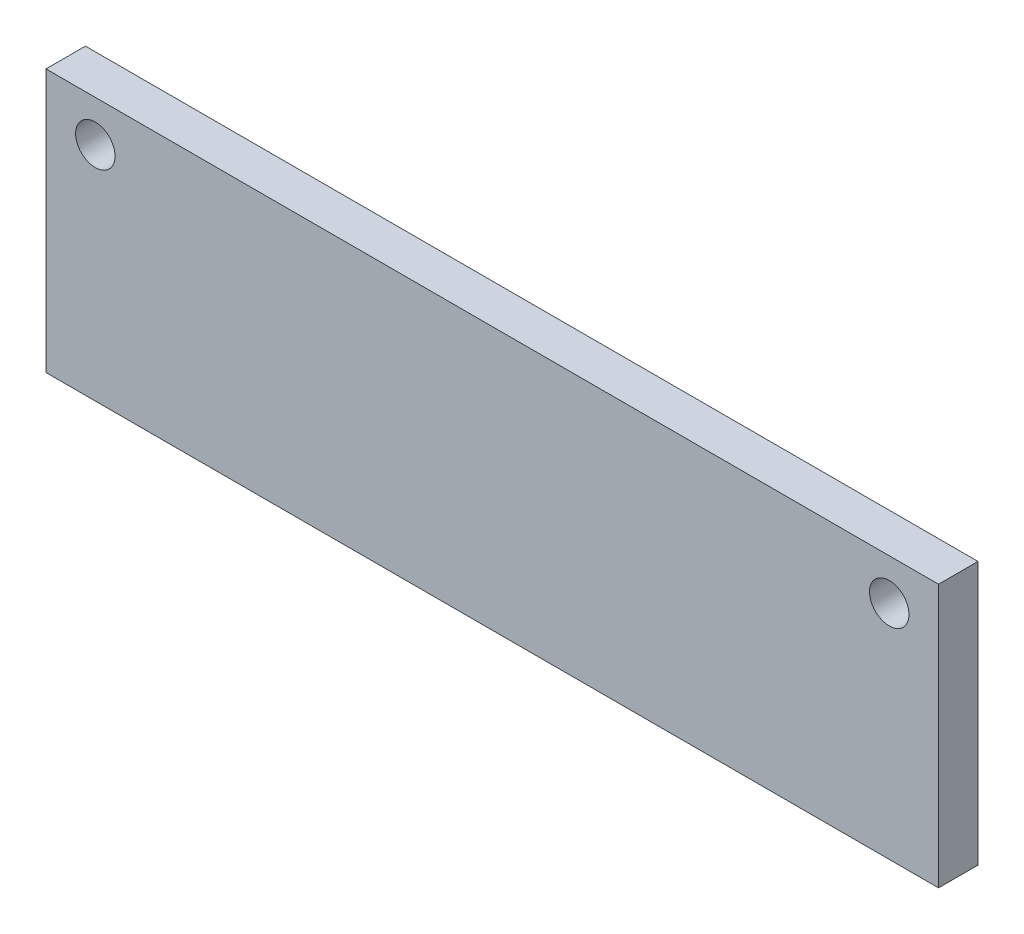
ISO-10303-21;
HEADER;
FILE_DESCRIPTION(('STEP AP214'),'2;1');
FILE_NAME('part.step','',(''),(''),'','','');
FILE_SCHEMA(('AUTOMOTIVE_DESIGN { 1 0 10303 214 1 1 1 1 }'));
ENDSEC;
DATA;
#1=APPLICATION_CONTEXT('core data for automotive mechanical design processes');
#2=APPLICATION_PROTOCOL_DEFINITION('international standard','automotive_design',2000,#1);
#3=PRODUCT_CONTEXT('',#1,'mechanical');
#4=PRODUCT('Part','Part','',(#3));
#5=PRODUCT_RELATED_PRODUCT_CATEGORY('part','',(#4));
#6=PRODUCT_DEFINITION_FORMATION('','',#4);
#7=PRODUCT_DEFINITION_CONTEXT('part definition',#1,'design');
#8=PRODUCT_DEFINITION('design','',#6,#7);
#9=PRODUCT_DEFINITION_SHAPE('','',#8);
#10=(LENGTH_UNIT() NAMED_UNIT(*) SI_UNIT(.MILLI.,.METRE.));
#11=(NAMED_UNIT(*) PLANE_ANGLE_UNIT() SI_UNIT($,.RADIAN.));
#12=(NAMED_UNIT(*) SI_UNIT($,.STERADIAN.) SOLID_ANGLE_UNIT());
#13=UNCERTAINTY_MEASURE_WITH_UNIT(LENGTH_MEASURE(1.E-05),#10,'distance_accuracy_value','');
#14=(GEOMETRIC_REPRESENTATION_CONTEXT(3) GLOBAL_UNCERTAINTY_ASSIGNED_CONTEXT((#13)) GLOBAL_UNIT_ASSIGNED_CONTEXT((#10,
#11,#12)) REPRESENTATION_CONTEXT('',''));
#15=CARTESIAN_POINT('',(0.,0.,0.));
#16=DIRECTION('',(0.,0.,1.));
#17=DIRECTION('',(1.,0.,0.));
#18=AXIS2_PLACEMENT_3D('',#15,#16,#17);
#19=CARTESIAN_POINT('',(-59.15,65.,40.));
#20=DIRECTION('',(0.,0.,1.));
#21=DIRECTION('',(1.,0.,0.));
#22=AXIS2_PLACEMENT_3D('',#19,#20,#21);
#23=PLANE('',#22);
#24=CARTESIAN_POINT('',(-7.85,78.5,40.));
#25=DIRECTION('',(0.,0.,1.));
#26=DIRECTION('',(1.,0.,0.));
#27=AXIS2_PLACEMENT_3D('',#24,#25,#26);
#28=CIRCLE('',#27,1.2);
#29=CARTESIAN_POINT('',(-6.65,78.5,40.));
#30=VERTEX_POINT('',#29);
#31=EDGE_CURVE('E83',#30,#30,#28,.T.);
#32=ORIENTED_EDGE('',*,*,#31,.T.);
#33=EDGE_LOOP('',(#32));
#34=FACE_BOUND('',#33,.T.);
#35=CARTESIAN_POINT('',(-56.15,78.5,40.));
#36=DIRECTION('',(0.,0.,1.));
#37=DIRECTION('',(1.,0.,0.));
#38=AXIS2_PLACEMENT_3D('',#35,#36,#37);
#39=CIRCLE('',#38,1.2);
#40=CARTESIAN_POINT('',(-54.95,78.5,40.));
#41=VERTEX_POINT('',#40);
#42=EDGE_CURVE('E19',#41,#41,#39,.T.);
#43=ORIENTED_EDGE('',*,*,#42,.T.);
#44=EDGE_LOOP('',(#43));
#45=FACE_BOUND('',#44,.T.);
#46=DIRECTION('',(0.,1.,0.));
#47=VECTOR('',#46,1.);
#48=CARTESIAN_POINT('',(-4.85,65.,40.));
#49=LINE('',#48,#47);
#50=CARTESIAN_POINT('',(-4.85,65.,40.));
#51=VERTEX_POINT('',#50);
#52=CARTESIAN_POINT('',(-4.85,81.,40.));
#53=VERTEX_POINT('',#52);
#54=EDGE_CURVE('E61',#51,#53,#49,.T.);
#55=ORIENTED_EDGE('',*,*,#54,.F.);
#56=DIRECTION('',(1.,0.,0.));
#57=VECTOR('',#56,1.);
#58=CARTESIAN_POINT('',(-59.15,65.,40.));
#59=LINE('',#58,#57);
#60=CARTESIAN_POINT('',(-59.15,65.,40.));
#61=VERTEX_POINT('',#60);
#62=EDGE_CURVE('E55',#51,#61,#59,.F.);
#63=ORIENTED_EDGE('',*,*,#62,.T.);
#64=DIRECTION('',(0.,1.,0.));
#65=VECTOR('',#64,1.);
#66=CARTESIAN_POINT('',(-59.15,65.,40.));
#67=LINE('',#66,#65);
#68=CARTESIAN_POINT('',(-59.15,81.,40.));
#69=VERTEX_POINT('',#68);
#70=EDGE_CURVE('E59',#61,#69,#67,.T.);
#71=ORIENTED_EDGE('',*,*,#70,.T.);
#72=DIRECTION('',(1.,0.,0.));
#73=VECTOR('',#72,1.);
#74=CARTESIAN_POINT('',(-59.15,81.,40.));
#75=LINE('',#74,#73);
#76=EDGE_CURVE('E94',#53,#69,#75,.F.);
#77=ORIENTED_EDGE('',*,*,#76,.F.);
#78=EDGE_LOOP('',(#55,#63,#71,#77));
#79=FACE_BOUND('',#78,.T.);
#80=ADVANCED_FACE('F16',(#34,#45,#79),#23,.F.);
#81=CARTESIAN_POINT('',(-59.15,65.,40.));
#82=DIRECTION('',(1.,0.,0.));
#83=DIRECTION('',(0.,0.,-1.));
#84=AXIS2_PLACEMENT_3D('',#81,#82,#83);
#85=PLANE('',#84);
#86=DIRECTION('',(0.,0.,1.));
#87=VECTOR('',#86,1.);
#88=CARTESIAN_POINT('',(-59.15,81.,40.));
#89=LINE('',#88,#87);
#90=CARTESIAN_POINT('',(-59.15,81.,42.4));
#91=VERTEX_POINT('',#90);
#92=EDGE_CURVE('E69',#69,#91,#89,.T.);
#93=ORIENTED_EDGE('',*,*,#92,.F.);
#94=ORIENTED_EDGE('',*,*,#70,.F.);
#95=DIRECTION('',(0.,0.,1.));
#96=VECTOR('',#95,1.);
#97=CARTESIAN_POINT('',(-59.15,65.,40.));
#98=LINE('',#97,#96);
#99=CARTESIAN_POINT('',(-59.15,65.,42.4));
#100=VERTEX_POINT('',#99);
#101=EDGE_CURVE('E63',#61,#100,#98,.T.);
#102=ORIENTED_EDGE('',*,*,#101,.T.);
#103=DIRECTION('',(0.,1.,0.));
#104=VECTOR('',#103,1.);
#105=CARTESIAN_POINT('',(-59.15,65.,42.4));
#106=LINE('',#105,#104);
#107=EDGE_CURVE('E85',#91,#100,#106,.F.);
#108=ORIENTED_EDGE('',*,*,#107,.F.);
#109=EDGE_LOOP('',(#93,#94,#102,#108));
#110=FACE_BOUND('',#109,.T.);
#111=ADVANCED_FACE('F66',(#110),#85,.F.);
#112=CARTESIAN_POINT('',(-59.15,65.,40.));
#113=DIRECTION('',(0.,1.,0.));
#114=DIRECTION('',(0.,0.,1.));
#115=AXIS2_PLACEMENT_3D('',#112,#113,#114);
#116=PLANE('',#115);
#117=DIRECTION('',(1.,0.,0.));
#118=VECTOR('',#117,1.);
#119=CARTESIAN_POINT('',(-59.15,65.,42.4));
#120=LINE('',#119,#118);
#121=CARTESIAN_POINT('',(-4.85,65.,42.4));
#122=VERTEX_POINT('',#121);
#123=EDGE_CURVE('E74',#100,#122,#120,.T.);
#124=ORIENTED_EDGE('',*,*,#123,.F.);
#125=ORIENTED_EDGE('',*,*,#101,.F.);
#126=ORIENTED_EDGE('',*,*,#62,.F.);
#127=DIRECTION('',(0.,0.,-1.));
#128=VECTOR('',#127,1.);
#129=CARTESIAN_POINT('',(-4.85,65.,40.));
#130=LINE('',#129,#128);
#131=EDGE_CURVE('E76',#122,#51,#130,.T.);
#132=ORIENTED_EDGE('',*,*,#131,.F.);
#133=EDGE_LOOP('',(#124,#125,#126,#132));
#134=FACE_BOUND('',#133,.T.);
#135=ADVANCED_FACE('F72',(#134),#116,.F.);
#136=CARTESIAN_POINT('',(-4.85,65.,40.));
#137=DIRECTION('',(1.,0.,0.));
#138=DIRECTION('',(0.,0.,-1.));
#139=AXIS2_PLACEMENT_3D('',#136,#137,#138);
#140=PLANE('',#139);
#141=DIRECTION('',(0.,0.,1.));
#142=VECTOR('',#141,1.);
#143=CARTESIAN_POINT('',(-4.85,81.,40.));
#144=LINE('',#143,#142);
#145=CARTESIAN_POINT('',(-4.85,81.,42.4));
#146=VERTEX_POINT('',#145);
#147=EDGE_CURVE('E34',#146,#53,#144,.F.);
#148=ORIENTED_EDGE('',*,*,#147,.F.);
#149=DIRECTION('',(0.,1.,0.));
#150=VECTOR('',#149,1.);
#151=CARTESIAN_POINT('',(-4.85,65.,42.4));
#152=LINE('',#151,#150);
#153=EDGE_CURVE('E100',#122,#146,#152,.T.);
#154=ORIENTED_EDGE('',*,*,#153,.F.);
#155=ORIENTED_EDGE('',*,*,#131,.T.);
#156=ORIENTED_EDGE('',*,*,#54,.T.);
#157=EDGE_LOOP('',(#148,#154,#155,#156));
#158=FACE_BOUND('',#157,.T.);
#159=ADVANCED_FACE('F98',(#158),#140,.T.);
#160=CARTESIAN_POINT('',(-59.15,81.,40.));
#161=DIRECTION('',(0.,1.,0.));
#162=DIRECTION('',(0.,0.,1.));
#163=AXIS2_PLACEMENT_3D('',#160,#161,#162);
#164=PLANE('',#163);
#165=DIRECTION('',(1.,0.,0.));
#166=VECTOR('',#165,1.);
#167=CARTESIAN_POINT('',(-59.15,81.,42.4));
#168=LINE('',#167,#166);
#169=EDGE_CURVE('E82',#146,#91,#168,.F.);
#170=ORIENTED_EDGE('',*,*,#169,.F.);
#171=ORIENTED_EDGE('',*,*,#147,.T.);
#172=ORIENTED_EDGE('',*,*,#76,.T.);
#173=ORIENTED_EDGE('',*,*,#92,.T.);
#174=EDGE_LOOP('',(#170,#171,#172,#173));
#175=FACE_BOUND('',#174,.T.);
#176=ADVANCED_FACE('F106',(#175),#164,.T.);
#177=CARTESIAN_POINT('',(-56.15,78.5,39.));
#178=DIRECTION('',(0.,0.,1.));
#179=DIRECTION('',(1.,0.,0.));
#180=AXIS2_PLACEMENT_3D('',#177,#178,#179);
#181=CYLINDRICAL_SURFACE('',#180,1.2);
#182=ORIENTED_EDGE('',*,*,#42,.F.);
#183=EDGE_LOOP('',(#182));
#184=FACE_BOUND('',#183,.T.);
#185=CARTESIAN_POINT('',(-56.15,78.5,42.4));
#186=DIRECTION('',(0.,0.,1.));
#187=DIRECTION('',(1.,0.,0.));
#188=AXIS2_PLACEMENT_3D('',#185,#186,#187);
#189=CIRCLE('',#188,1.2);
#190=CARTESIAN_POINT('',(-54.95,78.5,42.4));
#191=VERTEX_POINT('',#190);
#192=EDGE_CURVE('E25',#191,#191,#189,.F.);
#193=ORIENTED_EDGE('',*,*,#192,.F.);
#194=EDGE_LOOP('',(#193));
#195=FACE_BOUND('',#194,.T.);
#196=ADVANCED_FACE('F108',(#184,#195),#181,.F.);
#197=CARTESIAN_POINT('',(-7.85,78.5,39.));
#198=DIRECTION('',(0.,0.,1.));
#199=DIRECTION('',(1.,0.,0.));
#200=AXIS2_PLACEMENT_3D('',#197,#198,#199);
#201=CYLINDRICAL_SURFACE('',#200,1.2);
#202=ORIENTED_EDGE('',*,*,#31,.F.);
#203=EDGE_LOOP('',(#202));
#204=FACE_BOUND('',#203,.T.);
#205=CARTESIAN_POINT('',(-7.85,78.5,42.4));
#206=DIRECTION('',(0.,0.,1.));
#207=DIRECTION('',(1.,0.,0.));
#208=AXIS2_PLACEMENT_3D('',#205,#206,#207);
#209=CIRCLE('',#208,1.2);
#210=CARTESIAN_POINT('',(-6.65,78.5,42.4));
#211=VERTEX_POINT('',#210);
#212=EDGE_CURVE('E10',#211,#211,#209,.F.);
#213=ORIENTED_EDGE('',*,*,#212,.F.);
#214=EDGE_LOOP('',(#213));
#215=FACE_BOUND('',#214,.T.);
#216=ADVANCED_FACE('F115',(#204,#215),#201,.F.);
#217=CARTESIAN_POINT('',(-59.15,65.,42.4));
#218=DIRECTION('',(0.,0.,1.));
#219=DIRECTION('',(1.,0.,0.));
#220=AXIS2_PLACEMENT_3D('',#217,#218,#219);
#221=PLANE('',#220);
#222=ORIENTED_EDGE('',*,*,#212,.T.);
#223=EDGE_LOOP('',(#222));
#224=FACE_BOUND('',#223,.T.);
#225=ORIENTED_EDGE('',*,*,#192,.T.);
#226=EDGE_LOOP('',(#225));
#227=FACE_BOUND('',#226,.T.);
#228=ORIENTED_EDGE('',*,*,#153,.T.);
#229=ORIENTED_EDGE('',*,*,#169,.T.);
#230=ORIENTED_EDGE('',*,*,#107,.T.);
#231=ORIENTED_EDGE('',*,*,#123,.T.);
#232=EDGE_LOOP('',(#228,#229,#230,#231));
#233=FACE_BOUND('',#232,.T.);
#234=ADVANCED_FACE('F104',(#224,#227,#233),#221,.T.);
#235=CLOSED_SHELL('',(#80,#111,#135,#159,#176,#196,#216,#234));
#236=MANIFOLD_SOLID_BREP('B1',#235);
#237=ADVANCED_BREP_SHAPE_REPRESENTATION('',(#18,#236),#14);
#238=SHAPE_DEFINITION_REPRESENTATION(#9,#237);
ENDSEC;
END-ISO-10303-21;
